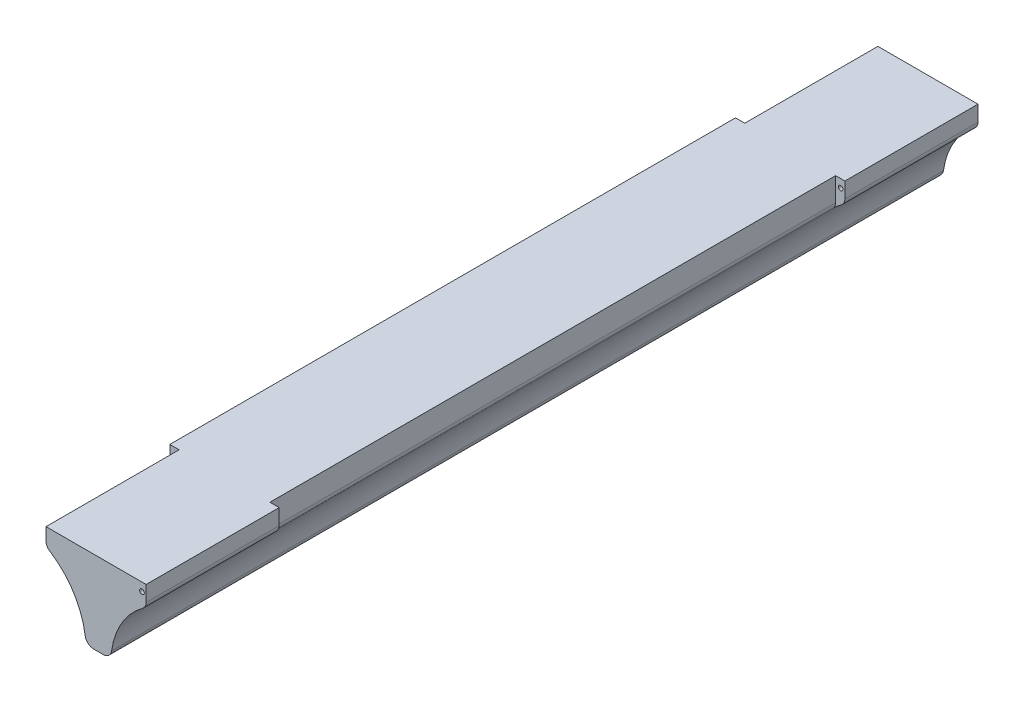
ISO-10303-21;
HEADER;
FILE_DESCRIPTION(('STEP AP214'),'2;1');
FILE_NAME('part.step','',(''),(''),'','','');
FILE_SCHEMA(('AUTOMOTIVE_DESIGN { 1 0 10303 214 1 1 1 1 }'));
ENDSEC;
DATA;
#1=APPLICATION_CONTEXT('core data for automotive mechanical design processes');
#2=APPLICATION_PROTOCOL_DEFINITION('international standard','automotive_design',2000,#1);
#3=PRODUCT_CONTEXT('',#1,'mechanical');
#4=PRODUCT('Part','Part','',(#3));
#5=PRODUCT_RELATED_PRODUCT_CATEGORY('part','',(#4));
#6=PRODUCT_DEFINITION_FORMATION('','',#4);
#7=PRODUCT_DEFINITION_CONTEXT('part definition',#1,'design');
#8=PRODUCT_DEFINITION('design','',#6,#7);
#9=PRODUCT_DEFINITION_SHAPE('','',#8);
#10=(LENGTH_UNIT() NAMED_UNIT(*) SI_UNIT(.MILLI.,.METRE.));
#11=(NAMED_UNIT(*) PLANE_ANGLE_UNIT() SI_UNIT($,.RADIAN.));
#12=(NAMED_UNIT(*) SI_UNIT($,.STERADIAN.) SOLID_ANGLE_UNIT());
#13=UNCERTAINTY_MEASURE_WITH_UNIT(LENGTH_MEASURE(1.E-05),#10,'distance_accuracy_value','');
#14=(GEOMETRIC_REPRESENTATION_CONTEXT(3) GLOBAL_UNCERTAINTY_ASSIGNED_CONTEXT((#13)) GLOBAL_UNIT_ASSIGNED_CONTEXT((#10,
#11,#12)) REPRESENTATION_CONTEXT('',''));
#15=CARTESIAN_POINT('',(0.,0.,0.));
#16=DIRECTION('',(0.,0.,1.));
#17=DIRECTION('',(1.,0.,0.));
#18=AXIS2_PLACEMENT_3D('',#15,#16,#17);
#19=CARTESIAN_POINT('',(-3.43878578810215,2.46500868702452,-25.));
#20=DIRECTION('',(0.,0.,1.));
#21=DIRECTION('',(1.,0.,0.));
#22=AXIS2_PLACEMENT_3D('',#19,#20,#21);
#23=CYLINDRICAL_SURFACE('',#22,0.125822813650088);
#24=CARTESIAN_POINT('',(-3.43878578810215,2.46500868702452,-17.));
#25=DIRECTION('',(0.,0.,-1.));
#26=DIRECTION('',(-1.,0.,0.));
#27=AXIS2_PLACEMENT_3D('',#24,#25,#26);
#28=CIRCLE('',#27,0.125822813650088);
#29=CARTESIAN_POINT('',(-3.56460860175224,2.46500868702452,-17.));
#30=VERTEX_POINT('',#29);
#31=EDGE_CURVE('E295',#30,#30,#28,.T.);
#32=ORIENTED_EDGE('',*,*,#31,.T.);
#33=EDGE_LOOP('',(#32));
#34=FACE_BOUND('',#33,.T.);
#35=CARTESIAN_POINT('',(-3.43878578810215,2.46500868702452,-24.));
#36=DIRECTION('',(0.,0.,1.));
#37=DIRECTION('',(1.,0.,0.));
#38=AXIS2_PLACEMENT_3D('',#35,#36,#37);
#39=CIRCLE('',#38,0.125822813650089);
#40=CARTESIAN_POINT('',(-3.31296297445206,2.46500868702452,-24.));
#41=VERTEX_POINT('',#40);
#42=EDGE_CURVE('E299',#41,#41,#39,.T.);
#43=ORIENTED_EDGE('',*,*,#42,.T.);
#44=EDGE_LOOP('',(#43));
#45=FACE_BOUND('',#44,.T.);
#46=ADVANCED_FACE('F103',(#34,#45),#23,.T.);
#47=CARTESIAN_POINT('',(-3.43878578810215,2.46500868702452,25.));
#48=DIRECTION('',(0.,0.,-1.));
#49=DIRECTION('',(-1.,0.,0.));
#50=AXIS2_PLACEMENT_3D('',#47,#48,#49);
#51=CYLINDRICAL_SURFACE('',#50,0.125822813650088);
#52=CARTESIAN_POINT('',(-3.43878578810215,2.46500868702452,17.));
#53=DIRECTION('',(0.,0.,-1.));
#54=DIRECTION('',(-1.,0.,0.));
#55=AXIS2_PLACEMENT_3D('',#52,#53,#54);
#56=CIRCLE('',#55,0.125822813650088);
#57=CARTESIAN_POINT('',(-3.56460860175224,2.46500868702452,17.));
#58=VERTEX_POINT('',#57);
#59=EDGE_CURVE('E301',#58,#58,#56,.T.);
#60=ORIENTED_EDGE('',*,*,#59,.F.);
#61=EDGE_LOOP('',(#60));
#62=FACE_BOUND('',#61,.T.);
#63=CARTESIAN_POINT('',(-3.43878578810215,2.46500868702452,24.));
#64=DIRECTION('',(0.,0.,1.));
#65=DIRECTION('',(1.,0.,0.));
#66=AXIS2_PLACEMENT_3D('',#63,#64,#65);
#67=CIRCLE('',#66,0.125822813650089);
#68=CARTESIAN_POINT('',(-3.31296297445206,2.46500868702452,24.));
#69=VERTEX_POINT('',#68);
#70=EDGE_CURVE('E280',#69,#69,#67,.T.);
#71=ORIENTED_EDGE('',*,*,#70,.F.);
#72=EDGE_LOOP('',(#71));
#73=FACE_BOUND('',#72,.T.);
#74=ADVANCED_FACE('F597',(#62,#73),#51,.T.);
#75=CARTESIAN_POINT('',(2.86920806925575,0.,25.));
#76=DIRECTION('',(1.,0.,0.));
#77=DIRECTION('',(0.,1.,0.));
#78=AXIS2_PLACEMENT_3D('',#75,#76,#77);
#79=PLANE('',#78);
#80=DIRECTION('',(0.,1.,0.));
#81=VECTOR('',#80,1.);
#82=CARTESIAN_POINT('',(2.86920806925575,3.06854543083489,-17.));
#83=LINE('',#82,#81);
#84=CARTESIAN_POINT('',(2.86920806925575,2.13229461166655,-17.));
#85=VERTEX_POINT('',#84);
#86=CARTESIAN_POINT('',(2.86920806925575,3.06854543083489,-17.));
#87=VERTEX_POINT('',#86);
#88=EDGE_CURVE('E328',#85,#87,#83,.T.);
#89=ORIENTED_EDGE('',*,*,#88,.F.);
#90=DIRECTION('',(0.,0.,-1.));
#91=VECTOR('',#90,1.);
#92=CARTESIAN_POINT('',(2.86920806925575,2.13229461166655,25.));
#93=LINE('',#92,#91);
#94=CARTESIAN_POINT('',(2.86920806925575,2.13229461166655,-25.));
#95=VERTEX_POINT('',#94);
#96=EDGE_CURVE('E478',#85,#95,#93,.T.);
#97=ORIENTED_EDGE('',*,*,#96,.T.);
#98=DIRECTION('',(0.,-1.,0.));
#99=VECTOR('',#98,1.);
#100=CARTESIAN_POINT('',(2.86920806925575,0.,-25.));
#101=LINE('',#100,#99);
#102=CARTESIAN_POINT('',(2.86920806925575,3.06854543083489,-25.));
#103=VERTEX_POINT('',#102);
#104=EDGE_CURVE('E411',#103,#95,#101,.T.);
#105=ORIENTED_EDGE('',*,*,#104,.F.);
#106=DIRECTION('',(0.,0.,-1.));
#107=VECTOR('',#106,1.);
#108=CARTESIAN_POINT('',(2.86920806925575,3.06854543083489,25.));
#109=LINE('',#108,#107);
#110=EDGE_CURVE('E419',#87,#103,#109,.T.);
#111=ORIENTED_EDGE('',*,*,#110,.F.);
#112=EDGE_LOOP('',(#89,#97,#105,#111));
#113=FACE_BOUND('',#112,.T.);
#114=ADVANCED_FACE('F574',(#113),#79,.T.);
#115=CARTESIAN_POINT('',(-0.278549844655959,-1.34969065907953,25.));
#116=DIRECTION('',(0.,0.,-1.));
#117=DIRECTION('',(-1.,0.,0.));
#118=AXIS2_PLACEMENT_3D('',#115,#116,#117);
#119=CYLINDRICAL_SURFACE('',#118,0.522401061583565);
#120=CARTESIAN_POINT('',(-0.278549844655959,-1.34969065907953,-25.));
#121=DIRECTION('',(0.,0.,1.));
#122=DIRECTION('',(1.,0.,0.));
#123=AXIS2_PLACEMENT_3D('',#120,#121,#122);
#124=CIRCLE('',#123,0.522401061583565);
#125=CARTESIAN_POINT('',(-0.796044874215448,-1.42111728944144,-25.));
#126=VERTEX_POINT('',#125);
#127=CARTESIAN_POINT('',(-0.271314783755804,-1.87204161680567,-25.));
#128=VERTEX_POINT('',#127);
#129=EDGE_CURVE('E396',#126,#128,#124,.T.);
#130=ORIENTED_EDGE('',*,*,#129,.T.);
#131=DIRECTION('',(0.,0.,-1.));
#132=VECTOR('',#131,1.);
#133=CARTESIAN_POINT('',(-0.271314783755804,-1.87204161680567,25.));
#134=LINE('',#133,#132);
#135=CARTESIAN_POINT('',(-0.271314783755804,-1.87204161680567,25.));
#136=VERTEX_POINT('',#135);
#137=EDGE_CURVE('E431',#136,#128,#134,.T.);
#138=ORIENTED_EDGE('',*,*,#137,.F.);
#139=CARTESIAN_POINT('',(-0.278549844655959,-1.34969065907953,25.));
#140=DIRECTION('',(0.,0.,1.));
#141=DIRECTION('',(1.,0.,0.));
#142=AXIS2_PLACEMENT_3D('',#139,#140,#141);
#143=CIRCLE('',#142,0.522401061583565);
#144=CARTESIAN_POINT('',(-0.796044874215448,-1.42111728944144,25.));
#145=VERTEX_POINT('',#144);
#146=EDGE_CURVE('E371',#145,#136,#143,.T.);
#147=ORIENTED_EDGE('',*,*,#146,.F.);
#148=DIRECTION('',(0.,0.,-1.));
#149=VECTOR('',#148,1.);
#150=CARTESIAN_POINT('',(-0.796044874215448,-1.42111728944144,25.));
#151=LINE('',#150,#149);
#152=EDGE_CURVE('E434',#145,#126,#151,.T.);
#153=ORIENTED_EDGE('',*,*,#152,.T.);
#154=EDGE_LOOP('',(#130,#138,#147,#153));
#155=FACE_BOUND('',#154,.T.);
#156=ADVANCED_FACE('F521',(#155),#119,.T.);
#157=CARTESIAN_POINT('',(0.,-21.4602025315357,25.));
#158=DIRECTION('',(0.,0.,-1.));
#159=DIRECTION('',(-1.,0.,0.));
#160=AXIS2_PLACEMENT_3D('',#157,#158,#159);
#161=CYLINDRICAL_SURFACE('',#160,19.5900398093838);
#162=CARTESIAN_POINT('',(0.,-21.4602025315357,-25.));
#163=DIRECTION('',(0.,0.,1.));
#164=DIRECTION('',(1.,0.,0.));
#165=AXIS2_PLACEMENT_3D('',#162,#163,#164);
#166=CIRCLE('',#165,19.5900398093838);
#167=CARTESIAN_POINT('',(0.271314783755798,-1.87204161680567,-25.));
#168=VERTEX_POINT('',#167);
#169=EDGE_CURVE('E400',#168,#128,#166,.T.);
#170=ORIENTED_EDGE('',*,*,#169,.F.);
#171=DIRECTION('',(0.,0.,-1.));
#172=VECTOR('',#171,1.);
#173=CARTESIAN_POINT('',(0.271314783755798,-1.87204161680567,25.));
#174=LINE('',#173,#172);
#175=CARTESIAN_POINT('',(0.271314783755798,-1.87204161680567,25.));
#176=VERTEX_POINT('',#175);
#177=EDGE_CURVE('E428',#176,#168,#174,.T.);
#178=ORIENTED_EDGE('',*,*,#177,.F.);
#179=CARTESIAN_POINT('',(0.,-21.4602025315357,25.));
#180=DIRECTION('',(0.,0.,1.));
#181=DIRECTION('',(1.,0.,0.));
#182=AXIS2_PLACEMENT_3D('',#179,#180,#181);
#183=CIRCLE('',#182,19.5900398093838);
#184=EDGE_CURVE('E374',#176,#136,#183,.T.);
#185=ORIENTED_EDGE('',*,*,#184,.T.);
#186=ORIENTED_EDGE('',*,*,#137,.T.);
#187=EDGE_LOOP('',(#170,#178,#185,#186));
#188=FACE_BOUND('',#187,.T.);
#189=ADVANCED_FACE('F814',(#188),#161,.F.);
#190=CARTESIAN_POINT('',(0.278549844656517,-1.34969065907954,25.));
#191=DIRECTION('',(0.,0.,-1.));
#192=DIRECTION('',(-1.,0.,0.));
#193=AXIS2_PLACEMENT_3D('',#190,#191,#192);
#194=CYLINDRICAL_SURFACE('',#193,0.52240106158357);
#195=CARTESIAN_POINT('',(0.278549844656517,-1.34969065907954,-25.));
#196=DIRECTION('',(0.,0.,1.));
#197=DIRECTION('',(1.,0.,0.));
#198=AXIS2_PLACEMENT_3D('',#195,#196,#197);
#199=CIRCLE('',#198,0.52240106158357);
#200=CARTESIAN_POINT('',(0.796044874215999,-1.42111728944155,-25.));
#201=VERTEX_POINT('',#200);
#202=EDGE_CURVE('E404',#168,#201,#199,.T.);
#203=ORIENTED_EDGE('',*,*,#202,.T.);
#204=DIRECTION('',(0.,0.,-1.));
#205=VECTOR('',#204,1.);
#206=CARTESIAN_POINT('',(0.796044874215999,-1.42111728944155,25.));
#207=LINE('',#206,#205);
#208=CARTESIAN_POINT('',(0.796044874215999,-1.42111728944155,25.));
#209=VERTEX_POINT('',#208);
#210=EDGE_CURVE('E424',#209,#201,#207,.T.);
#211=ORIENTED_EDGE('',*,*,#210,.F.);
#212=CARTESIAN_POINT('',(0.278549844656517,-1.34969065907954,25.));
#213=DIRECTION('',(0.,0.,1.));
#214=DIRECTION('',(1.,0.,0.));
#215=AXIS2_PLACEMENT_3D('',#212,#213,#214);
#216=CIRCLE('',#215,0.52240106158357);
#217=EDGE_CURVE('E378',#176,#209,#216,.T.);
#218=ORIENTED_EDGE('',*,*,#217,.F.);
#219=ORIENTED_EDGE('',*,*,#177,.T.);
#220=EDGE_LOOP('',(#203,#211,#218,#219));
#221=FACE_BOUND('',#220,.T.);
#222=ADVANCED_FACE('F804',(#221),#194,.T.);
#223=CARTESIAN_POINT('',(5.47386077616061,-2.06676721503345,25.));
#224=DIRECTION('',(0.,0.,-1.));
#225=DIRECTION('',(-1.,0.,0.));
#226=AXIS2_PLACEMENT_3D('',#223,#224,#225);
#227=CYLINDRICAL_SURFACE('',#226,4.72216321603804);
#228=DIRECTION('',(0.,0.,-1.));
#229=VECTOR('',#228,1.);
#230=CARTESIAN_POINT('',(2.16179102311862,1.29909365402918,25.));
#231=LINE('',#230,#229);
#232=CARTESIAN_POINT('',(2.16179102311862,1.29909365402918,-17.));
#233=VERTEX_POINT('',#232);
#234=CARTESIAN_POINT('',(2.16179102311862,1.29909365402918,17.));
#235=VERTEX_POINT('',#234);
#236=EDGE_CURVE('E443',#233,#235,#231,.F.);
#237=ORIENTED_EDGE('',*,*,#236,.T.);
#238=CARTESIAN_POINT('',(5.47386077616061,-2.06676721503345,17.));
#239=DIRECTION('',(0.,0.,1.));
#240=DIRECTION('',(1.,0.,0.));
#241=AXIS2_PLACEMENT_3D('',#238,#239,#240);
#242=CIRCLE('',#241,4.72216321603804);
#243=CARTESIAN_POINT('',(2.66646541055926,1.73025223449572,17.));
#244=VERTEX_POINT('',#243);
#245=EDGE_CURVE('E363',#244,#235,#242,.T.);
#246=ORIENTED_EDGE('',*,*,#245,.F.);
#247=DIRECTION('',(0.,0.,-1.));
#248=VECTOR('',#247,1.);
#249=CARTESIAN_POINT('',(2.66646541055926,1.73025223449572,25.));
#250=LINE('',#249,#248);
#251=CARTESIAN_POINT('',(2.66646541055926,1.73025223449572,25.));
#252=VERTEX_POINT('',#251);
#253=EDGE_CURVE('E437',#244,#252,#250,.F.);
#254=ORIENTED_EDGE('',*,*,#253,.T.);
#255=CARTESIAN_POINT('',(5.47386077616061,-2.06676721503345,25.));
#256=DIRECTION('',(0.,0.,1.));
#257=DIRECTION('',(1.,0.,0.));
#258=AXIS2_PLACEMENT_3D('',#255,#256,#257);
#259=CIRCLE('',#258,4.72216321603804);
#260=EDGE_CURVE('E382',#252,#209,#259,.T.);
#261=ORIENTED_EDGE('',*,*,#260,.T.);
#262=ORIENTED_EDGE('',*,*,#210,.T.);
#263=CARTESIAN_POINT('',(5.47386077616061,-2.06676721503345,-25.));
#264=DIRECTION('',(0.,0.,1.));
#265=DIRECTION('',(1.,0.,0.));
#266=AXIS2_PLACEMENT_3D('',#263,#264,#265);
#267=CIRCLE('',#266,4.72216321603804);
#268=CARTESIAN_POINT('',(2.66646541055926,1.73025223449572,-25.));
#269=VERTEX_POINT('',#268);
#270=EDGE_CURVE('E408',#269,#201,#267,.T.);
#271=ORIENTED_EDGE('',*,*,#270,.F.);
#272=DIRECTION('',(0.,0.,-1.));
#273=VECTOR('',#272,1.);
#274=CARTESIAN_POINT('',(2.66646541055926,1.73025223449572,25.));
#275=LINE('',#274,#273);
#276=CARTESIAN_POINT('',(2.66646541055926,1.73025223449572,-17.));
#277=VERTEX_POINT('',#276);
#278=EDGE_CURVE('E440',#269,#277,#275,.F.);
#279=ORIENTED_EDGE('',*,*,#278,.T.);
#280=CARTESIAN_POINT('',(5.47386077616061,-2.06676721503345,-17.));
#281=DIRECTION('',(0.,0.,1.));
#282=DIRECTION('',(1.,0.,0.));
#283=AXIS2_PLACEMENT_3D('',#280,#281,#282);
#284=CIRCLE('',#283,4.72216321603804);
#285=EDGE_CURVE('E360',#277,#233,#284,.T.);
#286=ORIENTED_EDGE('',*,*,#285,.T.);
#287=EDGE_LOOP('',(#237,#246,#254,#261,#262,#271,#279,#286));
#288=FACE_BOUND('',#287,.T.);
#289=ADVANCED_FACE('F557',(#288),#227,.F.);
#290=DIRECTION('',(0.,-1.,0.));
#291=VECTOR('',#290,1.);
#292=CARTESIAN_POINT('',(2.86920806925575,0.,25.));
#293=LINE('',#292,#291);
#294=CARTESIAN_POINT('',(2.86920806925575,3.06854543083489,25.));
#295=VERTEX_POINT('',#294);
#296=CARTESIAN_POINT('',(2.86920806925575,2.13229461166655,25.));
#297=VERTEX_POINT('',#296);
#298=EDGE_CURVE('E385',#295,#297,#293,.T.);
#299=ORIENTED_EDGE('',*,*,#298,.T.);
#300=DIRECTION('',(0.,0.,-1.));
#301=VECTOR('',#300,1.);
#302=CARTESIAN_POINT('',(2.86920806925575,2.13229461166655,25.));
#303=LINE('',#302,#301);
#304=CARTESIAN_POINT('',(2.86920806925575,2.13229461166655,17.));
#305=VERTEX_POINT('',#304);
#306=EDGE_CURVE('E485',#297,#305,#303,.T.);
#307=ORIENTED_EDGE('',*,*,#306,.T.);
#308=DIRECTION('',(0.,-1.,0.));
#309=VECTOR('',#308,1.);
#310=CARTESIAN_POINT('',(2.86920806925575,3.06854543083489,17.));
#311=LINE('',#310,#309);
#312=CARTESIAN_POINT('',(2.86920806925575,3.06854543083489,17.));
#313=VERTEX_POINT('',#312);
#314=EDGE_CURVE('E345',#313,#305,#311,.T.);
#315=ORIENTED_EDGE('',*,*,#314,.F.);
#316=EDGE_CURVE('E420',#295,#313,#109,.T.);
#317=ORIENTED_EDGE('',*,*,#316,.F.);
#318=EDGE_LOOP('',(#299,#307,#315,#317));
#319=FACE_BOUND('',#318,.T.);
#320=ADVANCED_FACE('F547',(#319),#79,.T.);
#321=CARTESIAN_POINT('',(0.,3.06854543083485,25.));
#322=DIRECTION('',(0.,1.,0.));
#323=DIRECTION('',(-1.,0.,0.));
#324=AXIS2_PLACEMENT_3D('',#321,#322,#323);
#325=PLANE('',#324);
#326=DIRECTION('',(1.,0.,0.));
#327=VECTOR('',#326,1.);
#328=CARTESIAN_POINT('',(-3.14844866988407,3.06854543083481,-17.));
#329=LINE('',#328,#327);
#330=CARTESIAN_POINT('',(-3.70655983665146,3.06854543083481,-17.));
#331=VERTEX_POINT('',#330);
#332=CARTESIAN_POINT('',(-3.14844866988407,3.06854543083481,-17.));
#333=VERTEX_POINT('',#332);
#334=EDGE_CURVE('E251',#331,#333,#329,.T.);
#335=ORIENTED_EDGE('',*,*,#334,.F.);
#336=DIRECTION('',(0.,0.,-1.));
#337=VECTOR('',#336,1.);
#338=CARTESIAN_POINT('',(-3.70655983665146,3.06854543083481,25.));
#339=LINE('',#338,#337);
#340=CARTESIAN_POINT('',(-3.70655983665146,3.06854543083481,17.));
#341=VERTEX_POINT('',#340);
#342=EDGE_CURVE('E392',#341,#331,#339,.T.);
#343=ORIENTED_EDGE('',*,*,#342,.F.);
#344=DIRECTION('',(1.,0.,0.));
#345=VECTOR('',#344,1.);
#346=CARTESIAN_POINT('',(-3.14844866988407,3.06854543083481,17.));
#347=LINE('',#346,#345);
#348=CARTESIAN_POINT('',(-3.14844866988407,3.06854543083481,17.));
#349=VERTEX_POINT('',#348);
#350=EDGE_CURVE('E319',#341,#349,#347,.T.);
#351=ORIENTED_EDGE('',*,*,#350,.T.);
#352=DIRECTION('',(0.,0.,-1.));
#353=VECTOR('',#352,1.);
#354=CARTESIAN_POINT('',(-3.14844866988407,3.06854543083481,25.));
#355=LINE('',#354,#353);
#356=CARTESIAN_POINT('',(-3.14844866988407,3.06854543083481,25.));
#357=VERTEX_POINT('',#356);
#358=EDGE_CURVE('E311',#357,#349,#355,.T.);
#359=ORIENTED_EDGE('',*,*,#358,.F.);
#360=DIRECTION('',(1.,0.,0.));
#361=VECTOR('',#360,1.);
#362=CARTESIAN_POINT('',(0.,3.06854543083485,25.));
#363=LINE('',#362,#361);
#364=EDGE_CURVE('E389',#357,#295,#363,.T.);
#365=ORIENTED_EDGE('',*,*,#364,.T.);
#366=ORIENTED_EDGE('',*,*,#316,.T.);
#367=DIRECTION('',(-1.,0.,0.));
#368=VECTOR('',#367,1.);
#369=CARTESIAN_POINT('',(2.86920806925575,3.06854543083489,17.));
#370=LINE('',#369,#368);
#371=CARTESIAN_POINT('',(2.31109690248836,3.06854543083489,17.));
#372=VERTEX_POINT('',#371);
#373=EDGE_CURVE('E344',#313,#372,#370,.T.);
#374=ORIENTED_EDGE('',*,*,#373,.T.);
#375=DIRECTION('',(0.,0.,-1.));
#376=VECTOR('',#375,1.);
#377=CARTESIAN_POINT('',(2.31109690248836,3.06854543083489,26.9024920046398));
#378=LINE('',#377,#376);
#379=CARTESIAN_POINT('',(2.31109690248836,3.06854543083489,-17.));
#380=VERTEX_POINT('',#379);
#381=EDGE_CURVE('E349',#372,#380,#378,.T.);
#382=ORIENTED_EDGE('',*,*,#381,.T.);
#383=DIRECTION('',(1.,0.,0.));
#384=VECTOR('',#383,1.);
#385=CARTESIAN_POINT('',(2.86920806925575,3.06854543083489,-17.));
#386=LINE('',#385,#384);
#387=EDGE_CURVE('E337',#380,#87,#386,.T.);
#388=ORIENTED_EDGE('',*,*,#387,.T.);
#389=ORIENTED_EDGE('',*,*,#110,.T.);
#390=DIRECTION('',(1.,0.,0.));
#391=VECTOR('',#390,1.);
#392=CARTESIAN_POINT('',(0.,3.06854543083485,-25.));
#393=LINE('',#392,#391);
#394=CARTESIAN_POINT('',(-3.14844866988407,3.06854543083481,-25.));
#395=VERTEX_POINT('',#394);
#396=EDGE_CURVE('E278',#395,#103,#393,.T.);
#397=ORIENTED_EDGE('',*,*,#396,.F.);
#398=DIRECTION('',(0.,0.,1.));
#399=VECTOR('',#398,1.);
#400=CARTESIAN_POINT('',(-3.14844866988407,3.06854543083481,-25.));
#401=LINE('',#400,#399);
#402=EDGE_CURVE('E268',#395,#333,#401,.T.);
#403=ORIENTED_EDGE('',*,*,#402,.T.);
#404=EDGE_LOOP('',(#335,#343,#351,#359,#365,#366,#374,#382,#388,#389,#397,#403));
#405=FACE_BOUND('',#404,.T.);
#406=ADVANCED_FACE('F276',(#405),#325,.T.);
#407=CARTESIAN_POINT('',(-3.70655983665142,0.,25.));
#408=DIRECTION('',(1.,0.,0.));
#409=DIRECTION('',(0.,1.,0.));
#410=AXIS2_PLACEMENT_3D('',#407,#408,#409);
#411=PLANE('',#410);
#412=DIRECTION('',(0.,1.,0.));
#413=VECTOR('',#412,1.);
#414=CARTESIAN_POINT('',(-3.70655983665146,3.06854543083481,-17.));
#415=LINE('',#414,#413);
#416=CARTESIAN_POINT('',(-3.70655983665145,2.63752179656491,-17.));
#417=VERTEX_POINT('',#416);
#418=EDGE_CURVE('E257',#417,#331,#415,.T.);
#419=ORIENTED_EDGE('',*,*,#418,.F.);
#420=DIRECTION('',(0.,0.,1.));
#421=VECTOR('',#420,1.);
#422=CARTESIAN_POINT('',(-3.70655983665145,2.63752179656491,17.));
#423=LINE('',#422,#421);
#424=CARTESIAN_POINT('',(-3.70655983665145,2.63752179656491,17.));
#425=VERTEX_POINT('',#424);
#426=EDGE_CURVE('E119',#417,#425,#423,.T.);
#427=ORIENTED_EDGE('',*,*,#426,.T.);
#428=DIRECTION('',(0.,1.,0.));
#429=VECTOR('',#428,1.);
#430=CARTESIAN_POINT('',(-3.70655983665146,3.06854543083481,17.));
#431=LINE('',#430,#429);
#432=EDGE_CURVE('E316',#425,#341,#431,.T.);
#433=ORIENTED_EDGE('',*,*,#432,.T.);
#434=ORIENTED_EDGE('',*,*,#342,.T.);
#435=EDGE_LOOP('',(#419,#427,#433,#434));
#436=FACE_BOUND('',#435,.T.);
#437=ADVANCED_FACE('F775',(#436),#411,.F.);
#438=CARTESIAN_POINT('',(-5.47386077616006,-2.06676721503334,25.));
#439=DIRECTION('',(0.,0.,-1.));
#440=DIRECTION('',(-1.,0.,0.));
#441=AXIS2_PLACEMENT_3D('',#438,#439,#440);
#442=CYLINDRICAL_SURFACE('',#441,4.72216321603804);
#443=CARTESIAN_POINT('',(-5.47386077616006,-2.06676721503334,-17.));
#444=DIRECTION('',(0.,0.,1.));
#445=DIRECTION('',(-1.,0.,0.));
#446=AXIS2_PLACEMENT_3D('',#443,#444,#445);
#447=CIRCLE('',#446,4.72216321603804);
#448=CARTESIAN_POINT('',(-2.91896990690695,1.90454970572604,-17.));
#449=VERTEX_POINT('',#448);
#450=CARTESIAN_POINT('',(-3.42364429434758,2.18710605724537,-17.));
#451=VERTEX_POINT('',#450);
#452=EDGE_CURVE('E273',#449,#451,#447,.T.);
#453=ORIENTED_EDGE('',*,*,#452,.F.);
#454=DIRECTION('',(0.,0.,-1.));
#455=VECTOR('',#454,1.);
#456=CARTESIAN_POINT('',(-2.91896990690695,1.90454970572604,25.));
#457=LINE('',#456,#455);
#458=CARTESIAN_POINT('',(-2.91896990690695,1.90454970572604,-25.));
#459=VERTEX_POINT('',#458);
#460=EDGE_CURVE('E460',#449,#459,#457,.T.);
#461=ORIENTED_EDGE('',*,*,#460,.T.);
#462=CARTESIAN_POINT('',(-5.47386077616006,-2.06676721503334,-25.));
#463=DIRECTION('',(0.,0.,1.));
#464=DIRECTION('',(1.,0.,0.));
#465=AXIS2_PLACEMENT_3D('',#462,#463,#464);
#466=CIRCLE('',#465,4.72216321603804);
#467=EDGE_CURVE('E366',#126,#459,#466,.T.);
#468=ORIENTED_EDGE('',*,*,#467,.F.);
#469=ORIENTED_EDGE('',*,*,#152,.F.);
#470=CARTESIAN_POINT('',(-5.47386077616006,-2.06676721503334,25.));
#471=DIRECTION('',(0.,0.,1.));
#472=DIRECTION('',(1.,0.,0.));
#473=AXIS2_PLACEMENT_3D('',#470,#471,#472);
#474=CIRCLE('',#473,4.72216321603804);
#475=CARTESIAN_POINT('',(-2.91896990690695,1.90454970572604,25.));
#476=VERTEX_POINT('',#475);
#477=EDGE_CURVE('E367',#145,#476,#474,.T.);
#478=ORIENTED_EDGE('',*,*,#477,.T.);
#479=DIRECTION('',(0.,0.,-1.));
#480=VECTOR('',#479,1.);
#481=CARTESIAN_POINT('',(-2.91896990690695,1.90454970572604,25.));
#482=LINE('',#481,#480);
#483=CARTESIAN_POINT('',(-2.91896990690695,1.90454970572604,17.));
#484=VERTEX_POINT('',#483);
#485=EDGE_CURVE('E456',#476,#484,#482,.T.);
#486=ORIENTED_EDGE('',*,*,#485,.T.);
#487=CARTESIAN_POINT('',(-5.47386077616006,-2.06676721503334,17.));
#488=DIRECTION('',(0.,0.,1.));
#489=DIRECTION('',(-1.,0.,0.));
#490=AXIS2_PLACEMENT_3D('',#487,#488,#489);
#491=CIRCLE('',#490,4.72216321603804);
#492=CARTESIAN_POINT('',(-3.42364429434758,2.18710605724537,17.));
#493=VERTEX_POINT('',#492);
#494=EDGE_CURVE('E305',#484,#493,#491,.T.);
#495=ORIENTED_EDGE('',*,*,#494,.T.);
#496=DIRECTION('',(0.,0.,-1.));
#497=VECTOR('',#496,1.);
#498=CARTESIAN_POINT('',(-3.42364429434758,2.18710605724537,25.));
#499=LINE('',#498,#497);
#500=EDGE_CURVE('E452',#493,#451,#499,.T.);
#501=ORIENTED_EDGE('',*,*,#500,.T.);
#502=EDGE_LOOP('',(#453,#461,#468,#469,#478,#486,#495,#501));
#503=FACE_BOUND('',#502,.T.);
#504=ADVANCED_FACE('F512',(#503),#442,.F.);
#505=CARTESIAN_POINT('',(0.,0.,-25.));
#506=DIRECTION('',(0.,0.,1.));
#507=DIRECTION('',(1.,0.,0.));
#508=AXIS2_PLACEMENT_3D('',#505,#506,#507);
#509=PLANE('',#508);
#510=ORIENTED_EDGE('',*,*,#467,.T.);
#511=CARTESIAN_POINT('',(-2.64844866988407,2.32504733986874,-25.));
#512=DIRECTION('',(0.,0.,1.));
#513=DIRECTION('',(1.,0.,0.));
#514=AXIS2_PLACEMENT_3D('',#511,#512,#513);
#515=CIRCLE('',#514,0.5);
#516=CARTESIAN_POINT('',(-3.14844866988407,2.32504733986874,-25.));
#517=VERTEX_POINT('',#516);
#518=EDGE_CURVE('E466',#459,#517,#515,.F.);
#519=ORIENTED_EDGE('',*,*,#518,.T.);
#520=DIRECTION('',(0.,-1.,0.));
#521=VECTOR('',#520,1.);
#522=CARTESIAN_POINT('',(-3.14844866988407,3.06854543083481,-25.));
#523=LINE('',#522,#521);
#524=EDGE_CURVE('E281',#395,#517,#523,.T.);
#525=ORIENTED_EDGE('',*,*,#524,.F.);
#526=ORIENTED_EDGE('',*,*,#396,.T.);
#527=ORIENTED_EDGE('',*,*,#104,.T.);
#528=CARTESIAN_POINT('',(2.36920806925575,2.13229461166655,-25.));
#529=DIRECTION('',(0.,0.,1.));
#530=DIRECTION('',(1.,0.,0.));
#531=AXIS2_PLACEMENT_3D('',#528,#529,#530);
#532=CIRCLE('',#531,0.5);
#533=EDGE_CURVE('E463',#95,#269,#532,.F.);
#534=ORIENTED_EDGE('',*,*,#533,.T.);
#535=ORIENTED_EDGE('',*,*,#270,.T.);
#536=ORIENTED_EDGE('',*,*,#202,.F.);
#537=ORIENTED_EDGE('',*,*,#169,.T.);
#538=ORIENTED_EDGE('',*,*,#129,.F.);
#539=EDGE_LOOP('',(#510,#519,#525,#526,#527,#534,#535,#536,#537,#538));
#540=FACE_BOUND('',#539,.T.);
#541=CARTESIAN_POINT('',(2.61920806925576,2.56854543083489,-25.));
#542=DIRECTION('',(0.,0.,-1.));
#543=DIRECTION('',(-1.,0.,0.));
#544=AXIS2_PLACEMENT_3D('',#541,#542,#543);
#545=CIRCLE('',#544,0.139327756215086);
#546=CARTESIAN_POINT('',(2.47988031304067,2.56854543083489,-25.));
#547=VERTEX_POINT('',#546);
#548=EDGE_CURVE('E291',#547,#547,#545,.T.);
#549=ORIENTED_EDGE('',*,*,#548,.F.);
#550=EDGE_LOOP('',(#549));
#551=FACE_BOUND('',#550,.T.);
#552=ADVANCED_FACE('F515',(#540,#551),#509,.F.);
#553=CARTESIAN_POINT('',(0.,0.,25.));
#554=DIRECTION('',(0.,0.,1.));
#555=DIRECTION('',(1.,0.,0.));
#556=AXIS2_PLACEMENT_3D('',#553,#554,#555);
#557=PLANE('',#556);
#558=DIRECTION('',(0.,-1.,0.));
#559=VECTOR('',#558,1.);
#560=CARTESIAN_POINT('',(-3.14844866988407,3.06854543083481,25.));
#561=LINE('',#560,#559);
#562=CARTESIAN_POINT('',(-3.14844866988407,2.32504733986874,25.));
#563=VERTEX_POINT('',#562);
#564=EDGE_CURVE('E307',#357,#563,#561,.T.);
#565=ORIENTED_EDGE('',*,*,#564,.T.);
#566=CARTESIAN_POINT('',(-2.64844866988407,2.32504733986874,25.));
#567=DIRECTION('',(0.,0.,1.));
#568=DIRECTION('',(1.,0.,0.));
#569=AXIS2_PLACEMENT_3D('',#566,#567,#568);
#570=CIRCLE('',#569,0.5);
#571=EDGE_CURVE('E475',#563,#476,#570,.T.);
#572=ORIENTED_EDGE('',*,*,#571,.T.);
#573=ORIENTED_EDGE('',*,*,#477,.F.);
#574=ORIENTED_EDGE('',*,*,#146,.T.);
#575=ORIENTED_EDGE('',*,*,#184,.F.);
#576=ORIENTED_EDGE('',*,*,#217,.T.);
#577=ORIENTED_EDGE('',*,*,#260,.F.);
#578=CARTESIAN_POINT('',(2.36920806925575,2.13229461166655,25.));
#579=DIRECTION('',(0.,0.,1.));
#580=DIRECTION('',(1.,0.,0.));
#581=AXIS2_PLACEMENT_3D('',#578,#579,#580);
#582=CIRCLE('',#581,0.5);
#583=EDGE_CURVE('E472',#252,#297,#582,.T.);
#584=ORIENTED_EDGE('',*,*,#583,.T.);
#585=ORIENTED_EDGE('',*,*,#298,.F.);
#586=ORIENTED_EDGE('',*,*,#364,.F.);
#587=EDGE_LOOP('',(#565,#572,#573,#574,#575,#576,#577,#584,#585,#586));
#588=FACE_BOUND('',#587,.T.);
#589=CARTESIAN_POINT('',(2.61920806925576,2.56854543083489,25.));
#590=DIRECTION('',(0.,0.,-1.));
#591=DIRECTION('',(-1.,0.,0.));
#592=AXIS2_PLACEMENT_3D('',#589,#590,#591);
#593=CIRCLE('',#592,0.139327756215086);
#594=CARTESIAN_POINT('',(2.47988031304067,2.56854543083489,25.));
#595=VERTEX_POINT('',#594);
#596=EDGE_CURVE('E286',#595,#595,#593,.T.);
#597=ORIENTED_EDGE('',*,*,#596,.T.);
#598=EDGE_LOOP('',(#597));
#599=FACE_BOUND('',#598,.T.);
#600=ADVANCED_FACE('F541',(#588,#599),#557,.T.);
#601=CARTESIAN_POINT('',(0.,0.,17.));
#602=DIRECTION('',(0.,0.,1.));
#603=DIRECTION('',(1.,0.,0.));
#604=AXIS2_PLACEMENT_3D('',#601,#602,#603);
#605=PLANE('',#604);
#606=CARTESIAN_POINT('',(2.61920806925576,2.56854543083489,17.));
#607=DIRECTION('',(0.,0.,-1.));
#608=DIRECTION('',(-1.,0.,0.));
#609=AXIS2_PLACEMENT_3D('',#606,#607,#608);
#610=CIRCLE('',#609,0.139327756215086);
#611=CARTESIAN_POINT('',(2.47988031304067,2.56854543083489,17.));
#612=VERTEX_POINT('',#611);
#613=EDGE_CURVE('E306',#612,#612,#610,.T.);
#614=ORIENTED_EDGE('',*,*,#613,.F.);
#615=EDGE_LOOP('',(#614));
#616=FACE_BOUND('',#615,.T.);
#617=ORIENTED_EDGE('',*,*,#314,.T.);
#618=CARTESIAN_POINT('',(2.36920806925575,2.13229461166655,17.));
#619=DIRECTION('',(0.,0.,1.));
#620=DIRECTION('',(1.,0.,0.));
#621=AXIS2_PLACEMENT_3D('',#618,#619,#620);
#622=CIRCLE('',#621,0.5);
#623=EDGE_CURVE('E489',#305,#244,#622,.F.);
#624=ORIENTED_EDGE('',*,*,#623,.T.);
#625=ORIENTED_EDGE('',*,*,#245,.T.);
#626=CARTESIAN_POINT('',(1.81109690248836,1.65548337576,17.));
#627=DIRECTION('',(0.,0.,1.));
#628=DIRECTION('',(1.,0.,0.));
#629=AXIS2_PLACEMENT_3D('',#626,#627,#628);
#630=CIRCLE('',#629,0.5);
#631=CARTESIAN_POINT('',(2.31109690248836,1.65548337576,17.));
#632=VERTEX_POINT('',#631);
#633=EDGE_CURVE('E499',#235,#632,#630,.T.);
#634=ORIENTED_EDGE('',*,*,#633,.T.);
#635=DIRECTION('',(0.,-1.,0.));
#636=VECTOR('',#635,1.);
#637=CARTESIAN_POINT('',(2.31109690248836,3.06854543083489,17.));
#638=LINE('',#637,#636);
#639=EDGE_CURVE('E350',#372,#632,#638,.T.);
#640=ORIENTED_EDGE('',*,*,#639,.F.);
#641=ORIENTED_EDGE('',*,*,#373,.F.);
#642=EDGE_LOOP('',(#617,#624,#625,#634,#640,#641));
#643=FACE_BOUND('',#642,.T.);
#644=ADVANCED_FACE('F554',(#616,#643),#605,.F.);
#645=CARTESIAN_POINT('',(2.31109690248836,3.06854543083489,26.9024920046398));
#646=DIRECTION('',(1.,0.,0.));
#647=DIRECTION('',(0.,0.,-1.));
#648=AXIS2_PLACEMENT_3D('',#645,#646,#647);
#649=PLANE('',#648);
#650=ORIENTED_EDGE('',*,*,#639,.T.);
#651=DIRECTION('',(0.,0.,-1.));
#652=VECTOR('',#651,1.);
#653=CARTESIAN_POINT('',(2.31109690248836,1.65548337576,26.9024920046398));
#654=LINE('',#653,#652);
#655=CARTESIAN_POINT('',(2.31109690248836,1.65548337576,-17.));
#656=VERTEX_POINT('',#655);
#657=EDGE_CURVE('E447',#632,#656,#654,.T.);
#658=ORIENTED_EDGE('',*,*,#657,.T.);
#659=DIRECTION('',(0.,1.,0.));
#660=VECTOR('',#659,1.);
#661=CARTESIAN_POINT('',(2.31109690248836,3.06854543083489,-17.));
#662=LINE('',#661,#660);
#663=EDGE_CURVE('E341',#656,#380,#662,.T.);
#664=ORIENTED_EDGE('',*,*,#663,.T.);
#665=ORIENTED_EDGE('',*,*,#381,.F.);
#666=EDGE_LOOP('',(#650,#658,#664,#665));
#667=FACE_BOUND('',#666,.T.);
#668=ADVANCED_FACE('F566',(#667),#649,.T.);
#669=CARTESIAN_POINT('',(0.,0.,-17.));
#670=DIRECTION('',(0.,0.,1.));
#671=DIRECTION('',(1.,0.,0.));
#672=AXIS2_PLACEMENT_3D('',#669,#670,#671);
#673=PLANE('',#672);
#674=CARTESIAN_POINT('',(2.61920806925576,2.56854543083489,-17.));
#675=DIRECTION('',(0.,0.,-1.));
#676=DIRECTION('',(-1.,0.,0.));
#677=AXIS2_PLACEMENT_3D('',#674,#675,#676);
#678=CIRCLE('',#677,0.139327756215086);
#679=CARTESIAN_POINT('',(2.47988031304067,2.56854543083489,-17.));
#680=VERTEX_POINT('',#679);
#681=EDGE_CURVE('E296',#680,#680,#678,.T.);
#682=ORIENTED_EDGE('',*,*,#681,.T.);
#683=EDGE_LOOP('',(#682));
#684=FACE_BOUND('',#683,.T.);
#685=ORIENTED_EDGE('',*,*,#285,.F.);
#686=CARTESIAN_POINT('',(2.36920806925575,2.13229461166655,-17.));
#687=DIRECTION('',(0.,0.,1.));
#688=DIRECTION('',(1.,0.,0.));
#689=AXIS2_PLACEMENT_3D('',#686,#687,#688);
#690=CIRCLE('',#689,0.5);
#691=EDGE_CURVE('E482',#277,#85,#690,.T.);
#692=ORIENTED_EDGE('',*,*,#691,.T.);
#693=ORIENTED_EDGE('',*,*,#88,.T.);
#694=ORIENTED_EDGE('',*,*,#387,.F.);
#695=ORIENTED_EDGE('',*,*,#663,.F.);
#696=CARTESIAN_POINT('',(1.81109690248836,1.65548337576,-17.));
#697=DIRECTION('',(0.,0.,1.));
#698=DIRECTION('',(1.,0.,0.));
#699=AXIS2_PLACEMENT_3D('',#696,#697,#698);
#700=CIRCLE('',#699,0.5);
#701=EDGE_CURVE('E502',#656,#233,#700,.F.);
#702=ORIENTED_EDGE('',*,*,#701,.T.);
#703=EDGE_LOOP('',(#685,#692,#693,#694,#695,#702));
#704=FACE_BOUND('',#703,.T.);
#705=ADVANCED_FACE('F583',(#684,#704),#673,.T.);
#706=CARTESIAN_POINT('',(2.61920806925576,2.56854543083489,25.));
#707=DIRECTION('',(0.,0.,-1.));
#708=DIRECTION('',(-1.,0.,0.));
#709=AXIS2_PLACEMENT_3D('',#706,#707,#708);
#710=CYLINDRICAL_SURFACE('',#709,0.139327756215086);
#711=ORIENTED_EDGE('',*,*,#596,.F.);
#712=EDGE_LOOP('',(#711));
#713=FACE_BOUND('',#712,.T.);
#714=ORIENTED_EDGE('',*,*,#613,.T.);
#715=EDGE_LOOP('',(#714));
#716=FACE_BOUND('',#715,.T.);
#717=ADVANCED_FACE('F585',(#713,#716),#710,.F.);
#718=CARTESIAN_POINT('',(-3.14844866988407,3.06854543083481,25.));
#719=DIRECTION('',(1.,0.,0.));
#720=DIRECTION('',(0.,1.,0.));
#721=AXIS2_PLACEMENT_3D('',#718,#719,#720);
#722=PLANE('',#721);
#723=DIRECTION('',(0.,-1.,0.));
#724=VECTOR('',#723,1.);
#725=CARTESIAN_POINT('',(-3.14844866988407,3.06854543083481,17.));
#726=LINE('',#725,#724);
#727=CARTESIAN_POINT('',(-3.14844866988407,2.32504733986874,17.));
#728=VERTEX_POINT('',#727);
#729=EDGE_CURVE('E312',#349,#728,#726,.T.);
#730=ORIENTED_EDGE('',*,*,#729,.T.);
#731=DIRECTION('',(0.,0.,1.));
#732=VECTOR('',#731,1.);
#733=CARTESIAN_POINT('',(-3.14844866988407,2.32504733986874,25.));
#734=LINE('',#733,#732);
#735=EDGE_CURVE('E469',#728,#563,#734,.T.);
#736=ORIENTED_EDGE('',*,*,#735,.T.);
#737=ORIENTED_EDGE('',*,*,#564,.F.);
#738=ORIENTED_EDGE('',*,*,#358,.T.);
#739=EDGE_LOOP('',(#730,#736,#737,#738));
#740=FACE_BOUND('',#739,.T.);
#741=ADVANCED_FACE('F536',(#740),#722,.F.);
#742=CARTESIAN_POINT('',(-5.47386077616006,-2.06676721503334,17.));
#743=DIRECTION('',(0.,0.,-1.));
#744=DIRECTION('',(-1.,0.,0.));
#745=AXIS2_PLACEMENT_3D('',#742,#743,#744);
#746=PLANE('',#745);
#747=ORIENTED_EDGE('',*,*,#59,.T.);
#748=EDGE_LOOP('',(#747));
#749=FACE_BOUND('',#748,.T.);
#750=ORIENTED_EDGE('',*,*,#432,.F.);
#751=CARTESIAN_POINT('',(-3.20655983665145,2.63752179656492,17.));
#752=DIRECTION('',(0.,0.,-1.));
#753=DIRECTION('',(-1.,0.,0.));
#754=AXIS2_PLACEMENT_3D('',#751,#752,#753);
#755=CIRCLE('',#754,0.5);
#756=EDGE_CURVE('E496',#425,#493,#755,.F.);
#757=ORIENTED_EDGE('',*,*,#756,.T.);
#758=ORIENTED_EDGE('',*,*,#494,.F.);
#759=CARTESIAN_POINT('',(-2.64844866988407,2.32504733986874,17.));
#760=DIRECTION('',(0.,0.,-1.));
#761=DIRECTION('',(-1.,0.,0.));
#762=AXIS2_PLACEMENT_3D('',#759,#760,#761);
#763=CIRCLE('',#762,0.5);
#764=EDGE_CURVE('E13',#484,#728,#763,.T.);
#765=ORIENTED_EDGE('',*,*,#764,.T.);
#766=ORIENTED_EDGE('',*,*,#729,.F.);
#767=ORIENTED_EDGE('',*,*,#350,.F.);
#768=EDGE_LOOP('',(#750,#757,#758,#765,#766,#767));
#769=FACE_BOUND('',#768,.T.);
#770=ADVANCED_FACE('F533',(#749,#769),#746,.F.);
#771=CARTESIAN_POINT('',(-3.43878578810215,2.46500868702452,24.));
#772=DIRECTION('',(0.,0.,1.));
#773=DIRECTION('',(1.,0.,0.));
#774=AXIS2_PLACEMENT_3D('',#771,#772,#773);
#775=PLANE('',#774);
#776=ORIENTED_EDGE('',*,*,#70,.T.);
#777=EDGE_LOOP('',(#776));
#778=FACE_BOUND('',#777,.T.);
#779=ADVANCED_FACE('F619',(#778),#775,.T.);
#780=CARTESIAN_POINT('',(2.61920806925576,2.56854543083489,-25.));
#781=DIRECTION('',(0.,0.,1.));
#782=DIRECTION('',(1.,0.,0.));
#783=AXIS2_PLACEMENT_3D('',#780,#781,#782);
#784=CYLINDRICAL_SURFACE('',#783,0.139327756215086);
#785=ORIENTED_EDGE('',*,*,#548,.T.);
#786=EDGE_LOOP('',(#785));
#787=FACE_BOUND('',#786,.T.);
#788=ORIENTED_EDGE('',*,*,#681,.F.);
#789=EDGE_LOOP('',(#788));
#790=FACE_BOUND('',#789,.T.);
#791=ADVANCED_FACE('F614',(#787,#790),#784,.F.);
#792=CARTESIAN_POINT('',(-5.47386077616006,-2.06676721503334,-17.));
#793=DIRECTION('',(0.,0.,1.));
#794=DIRECTION('',(-1.,0.,0.));
#795=AXIS2_PLACEMENT_3D('',#792,#793,#794);
#796=PLANE('',#795);
#797=ORIENTED_EDGE('',*,*,#452,.T.);
#798=CARTESIAN_POINT('',(-3.20655983665145,2.63752179656492,-17.));
#799=DIRECTION('',(0.,0.,1.));
#800=DIRECTION('',(1.,0.,0.));
#801=AXIS2_PLACEMENT_3D('',#798,#799,#800);
#802=CIRCLE('',#801,0.5);
#803=EDGE_CURVE('E127',#451,#417,#802,.F.);
#804=ORIENTED_EDGE('',*,*,#803,.T.);
#805=ORIENTED_EDGE('',*,*,#418,.T.);
#806=ORIENTED_EDGE('',*,*,#334,.T.);
#807=DIRECTION('',(0.,-1.,0.));
#808=VECTOR('',#807,1.);
#809=CARTESIAN_POINT('',(-3.14844866988407,3.06854543083481,-17.));
#810=LINE('',#809,#808);
#811=CARTESIAN_POINT('',(-3.14844866988407,2.32504733986874,-17.));
#812=VERTEX_POINT('',#811);
#813=EDGE_CURVE('E256',#333,#812,#810,.T.);
#814=ORIENTED_EDGE('',*,*,#813,.T.);
#815=CARTESIAN_POINT('',(-2.64844866988407,2.32504733986874,-17.));
#816=DIRECTION('',(0.,0.,1.));
#817=DIRECTION('',(1.,0.,0.));
#818=AXIS2_PLACEMENT_3D('',#815,#816,#817);
#819=CIRCLE('',#818,0.5);
#820=EDGE_CURVE('E112',#812,#449,#819,.T.);
#821=ORIENTED_EDGE('',*,*,#820,.T.);
#822=EDGE_LOOP('',(#797,#804,#805,#806,#814,#821));
#823=FACE_BOUND('',#822,.T.);
#824=ORIENTED_EDGE('',*,*,#31,.F.);
#825=EDGE_LOOP('',(#824));
#826=FACE_BOUND('',#825,.T.);
#827=ADVANCED_FACE('F253',(#823,#826),#796,.F.);
#828=CARTESIAN_POINT('',(-3.14844866988407,3.06854543083481,-25.));
#829=DIRECTION('',(-1.,0.,0.));
#830=DIRECTION('',(0.,-1.,0.));
#831=AXIS2_PLACEMENT_3D('',#828,#829,#830);
#832=PLANE('',#831);
#833=ORIENTED_EDGE('',*,*,#524,.T.);
#834=DIRECTION('',(0.,0.,-1.));
#835=VECTOR('',#834,1.);
#836=CARTESIAN_POINT('',(-3.14844866988407,2.32504733986874,-25.));
#837=LINE('',#836,#835);
#838=EDGE_CURVE('E271',#517,#812,#837,.F.);
#839=ORIENTED_EDGE('',*,*,#838,.T.);
#840=ORIENTED_EDGE('',*,*,#813,.F.);
#841=ORIENTED_EDGE('',*,*,#402,.F.);
#842=EDGE_LOOP('',(#833,#839,#840,#841));
#843=FACE_BOUND('',#842,.T.);
#844=ADVANCED_FACE('F267',(#843),#832,.T.);
#845=CARTESIAN_POINT('',(-3.43878578810215,2.46500868702452,-24.));
#846=DIRECTION('',(0.,0.,-1.));
#847=DIRECTION('',(1.,0.,0.));
#848=AXIS2_PLACEMENT_3D('',#845,#846,#847);
#849=PLANE('',#848);
#850=ORIENTED_EDGE('',*,*,#42,.F.);
#851=EDGE_LOOP('',(#850));
#852=FACE_BOUND('',#851,.T.);
#853=ADVANCED_FACE('F611',(#852),#849,.T.);
#854=CARTESIAN_POINT('',(1.81109690248836,1.65548337576,25.));
#855=DIRECTION('',(0.,0.,-1.));
#856=DIRECTION('',(-1.,0.,0.));
#857=AXIS2_PLACEMENT_3D('',#854,#855,#856);
#858=CYLINDRICAL_SURFACE('',#857,0.5);
#859=ORIENTED_EDGE('',*,*,#701,.F.);
#860=ORIENTED_EDGE('',*,*,#657,.F.);
#861=ORIENTED_EDGE('',*,*,#633,.F.);
#862=ORIENTED_EDGE('',*,*,#236,.F.);
#863=EDGE_LOOP('',(#859,#860,#861,#862));
#864=FACE_BOUND('',#863,.T.);
#865=ADVANCED_FACE('F562',(#864),#858,.T.);
#866=CARTESIAN_POINT('',(-2.64844866988407,2.32504733986874,25.));
#867=DIRECTION('',(0.,0.,-1.));
#868=DIRECTION('',(-1.,0.,0.));
#869=AXIS2_PLACEMENT_3D('',#866,#867,#868);
#870=CYLINDRICAL_SURFACE('',#869,0.5);
#871=ORIENTED_EDGE('',*,*,#518,.F.);
#872=ORIENTED_EDGE('',*,*,#460,.F.);
#873=ORIENTED_EDGE('',*,*,#820,.F.);
#874=ORIENTED_EDGE('',*,*,#838,.F.);
#875=EDGE_LOOP('',(#871,#872,#873,#874));
#876=FACE_BOUND('',#875,.T.);
#877=ADVANCED_FACE('F509',(#876),#870,.T.);
#878=CARTESIAN_POINT('',(-2.64844866988407,2.32504733986874,25.));
#879=DIRECTION('',(0.,0.,-1.));
#880=DIRECTION('',(-1.,0.,0.));
#881=AXIS2_PLACEMENT_3D('',#878,#879,#880);
#882=CYLINDRICAL_SURFACE('',#881,0.5);
#883=ORIENTED_EDGE('',*,*,#571,.F.);
#884=ORIENTED_EDGE('',*,*,#735,.F.);
#885=ORIENTED_EDGE('',*,*,#764,.F.);
#886=ORIENTED_EDGE('',*,*,#485,.F.);
#887=EDGE_LOOP('',(#883,#884,#885,#886));
#888=FACE_BOUND('',#887,.T.);
#889=ADVANCED_FACE('F529',(#888),#882,.T.);
#890=CARTESIAN_POINT('',(2.36920806925575,2.13229461166655,25.));
#891=DIRECTION('',(0.,0.,-1.));
#892=DIRECTION('',(-1.,0.,0.));
#893=AXIS2_PLACEMENT_3D('',#890,#891,#892);
#894=CYLINDRICAL_SURFACE('',#893,0.5);
#895=ORIENTED_EDGE('',*,*,#691,.F.);
#896=ORIENTED_EDGE('',*,*,#278,.F.);
#897=ORIENTED_EDGE('',*,*,#533,.F.);
#898=ORIENTED_EDGE('',*,*,#96,.F.);
#899=EDGE_LOOP('',(#895,#896,#897,#898));
#900=FACE_BOUND('',#899,.T.);
#901=ADVANCED_FACE('F582',(#900),#894,.T.);
#902=CARTESIAN_POINT('',(2.36920806925575,2.13229461166655,25.));
#903=DIRECTION('',(0.,0.,-1.));
#904=DIRECTION('',(-1.,0.,0.));
#905=AXIS2_PLACEMENT_3D('',#902,#903,#904);
#906=CYLINDRICAL_SURFACE('',#905,0.5);
#907=ORIENTED_EDGE('',*,*,#583,.F.);
#908=ORIENTED_EDGE('',*,*,#253,.F.);
#909=ORIENTED_EDGE('',*,*,#623,.F.);
#910=ORIENTED_EDGE('',*,*,#306,.F.);
#911=EDGE_LOOP('',(#907,#908,#909,#910));
#912=FACE_BOUND('',#911,.T.);
#913=ADVANCED_FACE('F550',(#912),#906,.T.);
#914=CARTESIAN_POINT('',(-3.20655983665145,2.63752179656492,25.));
#915=DIRECTION('',(0.,0.,-1.));
#916=DIRECTION('',(-1.,0.,0.));
#917=AXIS2_PLACEMENT_3D('',#914,#915,#916);
#918=CYLINDRICAL_SURFACE('',#917,0.5);
#919=ORIENTED_EDGE('',*,*,#756,.F.);
#920=ORIENTED_EDGE('',*,*,#426,.F.);
#921=ORIENTED_EDGE('',*,*,#803,.F.);
#922=ORIENTED_EDGE('',*,*,#500,.F.);
#923=EDGE_LOOP('',(#919,#920,#921,#922));
#924=FACE_BOUND('',#923,.T.);
#925=ADVANCED_FACE('F105',(#924),#918,.T.);
#926=CLOSED_SHELL('',(#46,#74,#114,#156,#189,#222,#289,#320,#406,#437,#504,#552,#600,#644,#668,
#705,#717,#741,#770,#779,#791,#827,#844,#853,#865,#877,#889,#901,#913,#925));
#927=MANIFOLD_SOLID_BREP('B2',#926);
#928=ADVANCED_BREP_SHAPE_REPRESENTATION('',(#18,#927),#14);
#929=SHAPE_DEFINITION_REPRESENTATION(#9,#928);
ENDSEC;
END-ISO-10303-21;
